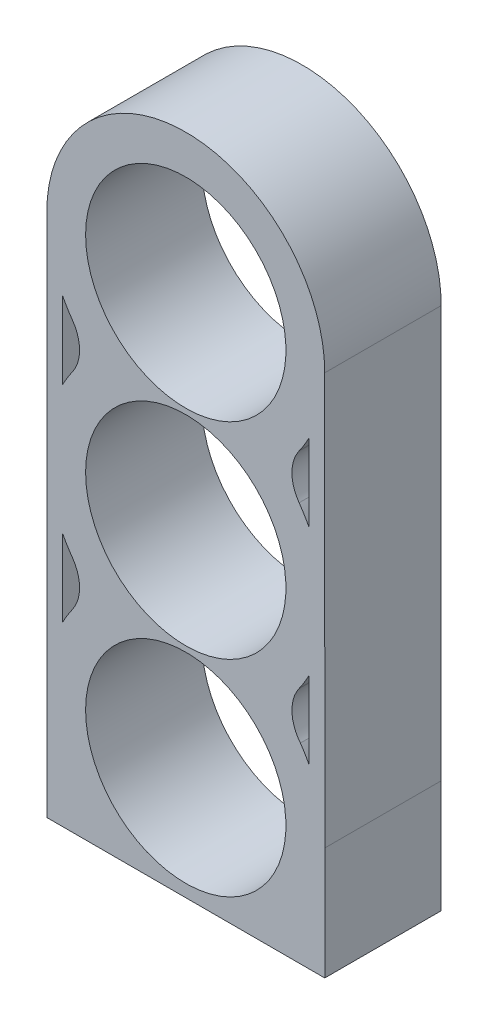
ISO-10303-21;
HEADER;
FILE_DESCRIPTION(('STEP AP214'),'2;1');
FILE_NAME('part.step','',(''),(''),'','','');
FILE_SCHEMA(('AUTOMOTIVE_DESIGN { 1 0 10303 214 1 1 1 1 }'));
ENDSEC;
DATA;
#1=APPLICATION_CONTEXT('core data for automotive mechanical design processes');
#2=APPLICATION_PROTOCOL_DEFINITION('international standard','automotive_design',2000,#1);
#3=PRODUCT_CONTEXT('',#1,'mechanical');
#4=PRODUCT('Part','Part','',(#3));
#5=PRODUCT_RELATED_PRODUCT_CATEGORY('part','',(#4));
#6=PRODUCT_DEFINITION_FORMATION('','',#4);
#7=PRODUCT_DEFINITION_CONTEXT('part definition',#1,'design');
#8=PRODUCT_DEFINITION('design','',#6,#7);
#9=PRODUCT_DEFINITION_SHAPE('','',#8);
#10=(LENGTH_UNIT() NAMED_UNIT(*) SI_UNIT(.MILLI.,.METRE.));
#11=(NAMED_UNIT(*) PLANE_ANGLE_UNIT() SI_UNIT($,.RADIAN.));
#12=(NAMED_UNIT(*) SI_UNIT($,.STERADIAN.) SOLID_ANGLE_UNIT());
#13=UNCERTAINTY_MEASURE_WITH_UNIT(LENGTH_MEASURE(1.E-05),#10,'distance_accuracy_value','');
#14=(GEOMETRIC_REPRESENTATION_CONTEXT(3) GLOBAL_UNCERTAINTY_ASSIGNED_CONTEXT((#13)) GLOBAL_UNIT_ASSIGNED_CONTEXT((#10,
#11,#12)) REPRESENTATION_CONTEXT('',''));
#15=CARTESIAN_POINT('',(0.,0.,0.));
#16=DIRECTION('',(0.,0.,1.));
#17=DIRECTION('',(1.,0.,0.));
#18=AXIS2_PLACEMENT_3D('',#15,#16,#17);
#19=CARTESIAN_POINT('',(45.4727606187345,0.00228368156702052,38.1));
#20=DIRECTION('',(0.999999998738932,5.02208692207655E-05,0.));
#21=DIRECTION('',(-5.02208692207655E-05,0.999999998738932,0.));
#22=AXIS2_PLACEMENT_3D('',#19,#20,#21);
#23=PLANE('',#22);
#24=DIRECTION('',(5.02208692207655E-05,-0.999999998738932,0.));
#25=VECTOR('',#24,1.);
#26=CARTESIAN_POINT('',(45.4727606187345,0.00228368156702052,0.));
#27=LINE('',#26,#25);
#28=CARTESIAN_POINT('',(45.466,134.62,0.));
#29=VERTEX_POINT('',#28);
#30=CARTESIAN_POINT('',(45.472760733423,0.,0.));
#31=VERTEX_POINT('',#30);
#32=EDGE_CURVE('E313',#29,#31,#27,.T.);
#33=ORIENTED_EDGE('',*,*,#32,.F.);
#34=DIRECTION('',(0.,0.,-1.));
#35=VECTOR('',#34,1.);
#36=CARTESIAN_POINT('',(45.466,134.62,38.1));
#37=LINE('',#36,#35);
#38=CARTESIAN_POINT('',(45.466,134.62,38.1));
#39=VERTEX_POINT('',#38);
#40=EDGE_CURVE('E11',#39,#29,#37,.T.);
#41=ORIENTED_EDGE('',*,*,#40,.F.);
#42=DIRECTION('',(5.02208692207655E-05,-0.999999998738932,0.));
#43=VECTOR('',#42,1.);
#44=CARTESIAN_POINT('',(45.4727606187345,0.00228368156702052,38.1));
#45=LINE('',#44,#43);
#46=CARTESIAN_POINT('',(45.472760733423,0.,38.1));
#47=VERTEX_POINT('',#46);
#48=EDGE_CURVE('E372',#39,#47,#45,.T.);
#49=ORIENTED_EDGE('',*,*,#48,.T.);
#50=DIRECTION('',(0.,0.,-1.));
#51=VECTOR('',#50,1.);
#52=CARTESIAN_POINT('',(45.472760733423,0.,38.1));
#53=LINE('',#52,#51);
#54=EDGE_CURVE('E54',#47,#31,#53,.T.);
#55=ORIENTED_EDGE('',*,*,#54,.T.);
#56=EDGE_LOOP('',(#33,#41,#49,#55));
#57=FACE_BOUND('',#56,.T.);
#58=ADVANCED_FACE('F35',(#57),#23,.T.);
#59=CARTESIAN_POINT('',(0.,134.62,38.1));
#60=DIRECTION('',(0.,0.,-1.));
#61=DIRECTION('',(-1.,0.,0.));
#62=AXIS2_PLACEMENT_3D('',#59,#60,#61);
#63=CYLINDRICAL_SURFACE('',#62,45.466);
#64=CARTESIAN_POINT('',(0.,134.62,0.));
#65=DIRECTION('',(0.,0.,1.));
#66=DIRECTION('',(1.,0.,0.));
#67=AXIS2_PLACEMENT_3D('',#64,#65,#66);
#68=CIRCLE('',#67,45.466);
#69=CARTESIAN_POINT('',(-45.466,134.62,0.));
#70=VERTEX_POINT('',#69);
#71=EDGE_CURVE('E315',#29,#70,#68,.T.);
#72=ORIENTED_EDGE('',*,*,#71,.T.);
#73=DIRECTION('',(0.,0.,-1.));
#74=VECTOR('',#73,1.);
#75=CARTESIAN_POINT('',(-45.466,134.62,38.1));
#76=LINE('',#75,#74);
#77=CARTESIAN_POINT('',(-45.466,134.62,38.1));
#78=VERTEX_POINT('',#77);
#79=EDGE_CURVE('E45',#78,#70,#76,.T.);
#80=ORIENTED_EDGE('',*,*,#79,.F.);
#81=CARTESIAN_POINT('',(0.,134.62,38.1));
#82=DIRECTION('',(0.,0.,1.));
#83=DIRECTION('',(1.,0.,0.));
#84=AXIS2_PLACEMENT_3D('',#81,#82,#83);
#85=CIRCLE('',#84,45.466);
#86=EDGE_CURVE('E201',#39,#78,#85,.T.);
#87=ORIENTED_EDGE('',*,*,#86,.F.);
#88=ORIENTED_EDGE('',*,*,#40,.T.);
#89=EDGE_LOOP('',(#72,#80,#87,#88));
#90=FACE_BOUND('',#89,.T.);
#91=ADVANCED_FACE('F377',(#90),#63,.T.);
#92=CARTESIAN_POINT('',(-45.466,0.,38.1));
#93=DIRECTION('',(1.,0.,0.));
#94=DIRECTION('',(0.,1.,0.));
#95=AXIS2_PLACEMENT_3D('',#92,#93,#94);
#96=PLANE('',#95);
#97=DIRECTION('',(0.,-1.,0.));
#98=VECTOR('',#97,1.);
#99=CARTESIAN_POINT('',(-45.466,0.,0.));
#100=LINE('',#99,#98);
#101=CARTESIAN_POINT('',(-45.466,-36.83,0.));
#102=VERTEX_POINT('',#101);
#103=EDGE_CURVE('E207',#70,#102,#100,.T.);
#104=ORIENTED_EDGE('',*,*,#103,.T.);
#105=DIRECTION('',(0.,0.,-1.));
#106=VECTOR('',#105,1.);
#107=CARTESIAN_POINT('',(-45.466,-36.83,38.1));
#108=LINE('',#107,#106);
#109=CARTESIAN_POINT('',(-45.466,-36.83,38.1));
#110=VERTEX_POINT('',#109);
#111=EDGE_CURVE('E190',#110,#102,#108,.T.);
#112=ORIENTED_EDGE('',*,*,#111,.F.);
#113=DIRECTION('',(0.,-1.,0.));
#114=VECTOR('',#113,1.);
#115=CARTESIAN_POINT('',(-45.466,0.,38.1));
#116=LINE('',#115,#114);
#117=EDGE_CURVE('E195',#78,#110,#116,.T.);
#118=ORIENTED_EDGE('',*,*,#117,.F.);
#119=ORIENTED_EDGE('',*,*,#79,.T.);
#120=EDGE_LOOP('',(#104,#112,#118,#119));
#121=FACE_BOUND('',#120,.T.);
#122=ADVANCED_FACE('F206',(#121),#96,.F.);
#123=CARTESIAN_POINT('',(0.,-36.83,38.1));
#124=DIRECTION('',(0.,1.,0.));
#125=DIRECTION('',(0.,0.,1.));
#126=AXIS2_PLACEMENT_3D('',#123,#124,#125);
#127=PLANE('',#126);
#128=DIRECTION('',(1.,0.,0.));
#129=VECTOR('',#128,1.);
#130=CARTESIAN_POINT('',(0.,-36.83,0.));
#131=LINE('',#130,#129);
#132=CARTESIAN_POINT('',(45.472760733423,-36.83,0.));
#133=VERTEX_POINT('',#132);
#134=EDGE_CURVE('E319',#102,#133,#131,.T.);
#135=ORIENTED_EDGE('',*,*,#134,.T.);
#136=DIRECTION('',(0.,0.,-1.));
#137=VECTOR('',#136,1.);
#138=CARTESIAN_POINT('',(45.472760733423,-36.83,38.1));
#139=LINE('',#138,#137);
#140=CARTESIAN_POINT('',(45.472760733423,-36.83,38.1));
#141=VERTEX_POINT('',#140);
#142=EDGE_CURVE('E119',#141,#133,#139,.T.);
#143=ORIENTED_EDGE('',*,*,#142,.F.);
#144=DIRECTION('',(1.,0.,0.));
#145=VECTOR('',#144,1.);
#146=CARTESIAN_POINT('',(0.,-36.83,38.1));
#147=LINE('',#146,#145);
#148=EDGE_CURVE('E186',#110,#141,#147,.T.);
#149=ORIENTED_EDGE('',*,*,#148,.F.);
#150=ORIENTED_EDGE('',*,*,#111,.T.);
#151=EDGE_LOOP('',(#135,#143,#149,#150));
#152=FACE_BOUND('',#151,.T.);
#153=ADVANCED_FACE('F188',(#152),#127,.F.);
#154=CARTESIAN_POINT('',(-40.386,0.,38.1));
#155=DIRECTION('',(1.,0.,0.));
#156=DIRECTION('',(0.,1.,0.));
#157=AXIS2_PLACEMENT_3D('',#154,#155,#156);
#158=PLANE('',#157);
#159=DIRECTION('',(0.,-1.,0.));
#160=VECTOR('',#159,1.);
#161=CARTESIAN_POINT('',(-40.386,0.,0.));
#162=LINE('',#161,#160);
#163=CARTESIAN_POINT('',(-40.386,113.736318332248,0.));
#164=VERTEX_POINT('',#163);
#165=CARTESIAN_POINT('',(-40.386,88.1936816677519,0.));
#166=VERTEX_POINT('',#165);
#167=EDGE_CURVE('E295',#164,#166,#162,.T.);
#168=ORIENTED_EDGE('',*,*,#167,.F.);
#169=DIRECTION('',(0.,0.,-1.));
#170=VECTOR('',#169,1.);
#171=CARTESIAN_POINT('',(-40.386,113.736318332248,38.1));
#172=LINE('',#171,#170);
#173=CARTESIAN_POINT('',(-40.386,113.736318332248,38.1));
#174=VERTEX_POINT('',#173);
#175=EDGE_CURVE('E220',#174,#164,#172,.T.);
#176=ORIENTED_EDGE('',*,*,#175,.F.);
#177=DIRECTION('',(0.,-1.,0.));
#178=VECTOR('',#177,1.);
#179=CARTESIAN_POINT('',(-40.386,0.,38.1));
#180=LINE('',#179,#178);
#181=CARTESIAN_POINT('',(-40.386,88.1936816677519,38.1));
#182=VERTEX_POINT('',#181);
#183=EDGE_CURVE('E356',#174,#182,#180,.T.);
#184=ORIENTED_EDGE('',*,*,#183,.T.);
#185=DIRECTION('',(0.,0.,-1.));
#186=VECTOR('',#185,1.);
#187=CARTESIAN_POINT('',(-40.386,88.1936816677519,38.1));
#188=LINE('',#187,#186);
#189=EDGE_CURVE('E213',#182,#166,#188,.T.);
#190=ORIENTED_EDGE('',*,*,#189,.T.);
#191=EDGE_LOOP('',(#168,#176,#184,#190));
#192=FACE_BOUND('',#191,.T.);
#193=ADVANCED_FACE('F418',(#192),#158,.T.);
#194=CARTESIAN_POINT('',(0.,134.62,38.1));
#195=DIRECTION('',(0.,0.,-1.));
#196=DIRECTION('',(-1.,0.,0.));
#197=AXIS2_PLACEMENT_3D('',#194,#195,#196);
#198=CYLINDRICAL_SURFACE('',#197,45.466);
#199=CARTESIAN_POINT('',(0.,134.62,0.));
#200=DIRECTION('',(0.,0.,1.));
#201=DIRECTION('',(1.,0.,0.));
#202=AXIS2_PLACEMENT_3D('',#199,#200,#201);
#203=CIRCLE('',#202,45.466);
#204=CARTESIAN_POINT('',(-37.0825057507235,108.313253275109,0.));
#205=VERTEX_POINT('',#204);
#206=EDGE_CURVE('E298',#164,#205,#203,.T.);
#207=ORIENTED_EDGE('',*,*,#206,.T.);
#208=DIRECTION('',(0.,0.,-1.));
#209=VECTOR('',#208,1.);
#210=CARTESIAN_POINT('',(-37.0825057507235,108.313253275109,38.1));
#211=LINE('',#210,#209);
#212=CARTESIAN_POINT('',(-37.0825057507235,108.313253275109,38.1));
#213=VERTEX_POINT('',#212);
#214=EDGE_CURVE('E218',#213,#205,#211,.T.);
#215=ORIENTED_EDGE('',*,*,#214,.F.);
#216=CARTESIAN_POINT('',(0.,134.62,38.1));
#217=DIRECTION('',(0.,0.,1.));
#218=DIRECTION('',(1.,0.,0.));
#219=AXIS2_PLACEMENT_3D('',#216,#217,#218);
#220=CIRCLE('',#219,45.466);
#221=EDGE_CURVE('E359',#174,#213,#220,.T.);
#222=ORIENTED_EDGE('',*,*,#221,.F.);
#223=ORIENTED_EDGE('',*,*,#175,.T.);
#224=EDGE_LOOP('',(#207,#215,#222,#223));
#225=FACE_BOUND('',#224,.T.);
#226=ADVANCED_FACE('F414',(#225),#198,.T.);
#227=CARTESIAN_POINT('',(-47.4407475805346,100.965,38.1));
#228=DIRECTION('',(0.,0.,-1.));
#229=DIRECTION('',(-1.,0.,0.));
#230=AXIS2_PLACEMENT_3D('',#227,#228,#229);
#231=CYLINDRICAL_SURFACE('',#230,12.7);
#232=CARTESIAN_POINT('',(-47.4407475805346,100.965,0.));
#233=DIRECTION('',(0.,0.,1.));
#234=DIRECTION('',(1.,0.,0.));
#235=AXIS2_PLACEMENT_3D('',#232,#233,#234);
#236=CIRCLE('',#235,12.7);
#237=CARTESIAN_POINT('',(-37.0825057507235,93.6167467248908,0.));
#238=VERTEX_POINT('',#237);
#239=EDGE_CURVE('E301',#238,#205,#236,.T.);
#240=ORIENTED_EDGE('',*,*,#239,.F.);
#241=DIRECTION('',(0.,0.,-1.));
#242=VECTOR('',#241,1.);
#243=CARTESIAN_POINT('',(-37.0825057507235,93.6167467248908,38.1));
#244=LINE('',#243,#242);
#245=CARTESIAN_POINT('',(-37.0825057507235,93.6167467248908,38.1));
#246=VERTEX_POINT('',#245);
#247=EDGE_CURVE('E215',#246,#238,#244,.T.);
#248=ORIENTED_EDGE('',*,*,#247,.F.);
#249=CARTESIAN_POINT('',(-47.4407475805346,100.965,38.1));
#250=DIRECTION('',(0.,0.,1.));
#251=DIRECTION('',(1.,0.,0.));
#252=AXIS2_PLACEMENT_3D('',#249,#250,#251);
#253=CIRCLE('',#252,12.7);
#254=EDGE_CURVE('E361',#246,#213,#253,.T.);
#255=ORIENTED_EDGE('',*,*,#254,.T.);
#256=ORIENTED_EDGE('',*,*,#214,.T.);
#257=EDGE_LOOP('',(#240,#248,#255,#256));
#258=FACE_BOUND('',#257,.T.);
#259=ADVANCED_FACE('F410',(#258),#231,.F.);
#260=CARTESIAN_POINT('',(-40.386,0.,38.1));
#261=DIRECTION('',(1.,0.,0.));
#262=DIRECTION('',(0.,1.,0.));
#263=AXIS2_PLACEMENT_3D('',#260,#261,#262);
#264=PLANE('',#263);
#265=DIRECTION('',(0.,-1.,0.));
#266=VECTOR('',#265,1.);
#267=CARTESIAN_POINT('',(-40.386,0.,0.));
#268=LINE('',#267,#266);
#269=CARTESIAN_POINT('',(-40.386,46.4263183322481,0.));
#270=VERTEX_POINT('',#269);
#271=CARTESIAN_POINT('',(-40.386,20.883681667752,0.));
#272=VERTEX_POINT('',#271);
#273=EDGE_CURVE('E283',#270,#272,#268,.T.);
#274=ORIENTED_EDGE('',*,*,#273,.F.);
#275=DIRECTION('',(0.,0.,-1.));
#276=VECTOR('',#275,1.);
#277=CARTESIAN_POINT('',(-40.386,46.4263183322481,38.1));
#278=LINE('',#277,#276);
#279=CARTESIAN_POINT('',(-40.386,46.4263183322481,38.1));
#280=VERTEX_POINT('',#279);
#281=EDGE_CURVE('E216',#280,#270,#278,.T.);
#282=ORIENTED_EDGE('',*,*,#281,.F.);
#283=DIRECTION('',(0.,-1.,0.));
#284=VECTOR('',#283,1.);
#285=CARTESIAN_POINT('',(-40.386,0.,38.1));
#286=LINE('',#285,#284);
#287=CARTESIAN_POINT('',(-40.386,20.883681667752,38.1));
#288=VERTEX_POINT('',#287);
#289=EDGE_CURVE('E346',#280,#288,#286,.T.);
#290=ORIENTED_EDGE('',*,*,#289,.T.);
#291=DIRECTION('',(0.,0.,-1.));
#292=VECTOR('',#291,1.);
#293=CARTESIAN_POINT('',(-40.386,20.883681667752,38.1));
#294=LINE('',#293,#292);
#295=EDGE_CURVE('E222',#288,#272,#294,.T.);
#296=ORIENTED_EDGE('',*,*,#295,.T.);
#297=EDGE_LOOP('',(#274,#282,#290,#296));
#298=FACE_BOUND('',#297,.T.);
#299=ADVANCED_FACE('F413',(#298),#264,.T.);
#300=CARTESIAN_POINT('',(0.,67.31,38.1));
#301=DIRECTION('',(0.,0.,-1.));
#302=DIRECTION('',(-1.,0.,0.));
#303=AXIS2_PLACEMENT_3D('',#300,#301,#302);
#304=CYLINDRICAL_SURFACE('',#303,45.466);
#305=CARTESIAN_POINT('',(0.,67.31,0.));
#306=DIRECTION('',(0.,0.,1.));
#307=DIRECTION('',(1.,0.,0.));
#308=AXIS2_PLACEMENT_3D('',#305,#306,#307);
#309=CIRCLE('',#308,45.466);
#310=CARTESIAN_POINT('',(-37.0825057507236,41.0032532751092,0.));
#311=VERTEX_POINT('',#310);
#312=EDGE_CURVE('E286',#270,#311,#309,.T.);
#313=ORIENTED_EDGE('',*,*,#312,.T.);
#314=DIRECTION('',(0.,0.,-1.));
#315=VECTOR('',#314,1.);
#316=CARTESIAN_POINT('',(-37.0825057507236,41.0032532751092,38.1));
#317=LINE('',#316,#315);
#318=CARTESIAN_POINT('',(-37.0825057507236,41.0032532751092,38.1));
#319=VERTEX_POINT('',#318);
#320=EDGE_CURVE('E227',#319,#311,#317,.T.);
#321=ORIENTED_EDGE('',*,*,#320,.F.);
#322=CARTESIAN_POINT('',(0.,67.31,38.1));
#323=DIRECTION('',(0.,0.,1.));
#324=DIRECTION('',(1.,0.,0.));
#325=AXIS2_PLACEMENT_3D('',#322,#323,#324);
#326=CIRCLE('',#325,45.466);
#327=EDGE_CURVE('E349',#280,#319,#326,.T.);
#328=ORIENTED_EDGE('',*,*,#327,.F.);
#329=ORIENTED_EDGE('',*,*,#281,.T.);
#330=EDGE_LOOP('',(#313,#321,#328,#329));
#331=FACE_BOUND('',#330,.T.);
#332=ADVANCED_FACE('F431',(#331),#304,.T.);
#333=CARTESIAN_POINT('',(-47.4407475805346,33.655,38.1));
#334=DIRECTION('',(0.,0.,-1.));
#335=DIRECTION('',(-1.,0.,0.));
#336=AXIS2_PLACEMENT_3D('',#333,#334,#335);
#337=CYLINDRICAL_SURFACE('',#336,12.7);
#338=CARTESIAN_POINT('',(-47.4407475805346,33.655,0.));
#339=DIRECTION('',(0.,0.,1.));
#340=DIRECTION('',(1.,0.,0.));
#341=AXIS2_PLACEMENT_3D('',#338,#339,#340);
#342=CIRCLE('',#341,12.7);
#343=CARTESIAN_POINT('',(-37.0825057507235,26.3067467248908,0.));
#344=VERTEX_POINT('',#343);
#345=EDGE_CURVE('E289',#344,#311,#342,.T.);
#346=ORIENTED_EDGE('',*,*,#345,.F.);
#347=DIRECTION('',(0.,0.,-1.));
#348=VECTOR('',#347,1.);
#349=CARTESIAN_POINT('',(-37.0825057507235,26.3067467248908,38.1));
#350=LINE('',#349,#348);
#351=CARTESIAN_POINT('',(-37.0825057507235,26.3067467248908,38.1));
#352=VERTEX_POINT('',#351);
#353=EDGE_CURVE('E224',#352,#344,#350,.T.);
#354=ORIENTED_EDGE('',*,*,#353,.F.);
#355=CARTESIAN_POINT('',(-47.4407475805346,33.655,38.1));
#356=DIRECTION('',(0.,0.,1.));
#357=DIRECTION('',(1.,0.,0.));
#358=AXIS2_PLACEMENT_3D('',#355,#356,#357);
#359=CIRCLE('',#358,12.7);
#360=EDGE_CURVE('E351',#352,#319,#359,.T.);
#361=ORIENTED_EDGE('',*,*,#360,.T.);
#362=ORIENTED_EDGE('',*,*,#320,.T.);
#363=EDGE_LOOP('',(#346,#354,#361,#362));
#364=FACE_BOUND('',#363,.T.);
#365=ADVANCED_FACE('F427',(#364),#337,.F.);
#366=CARTESIAN_POINT('',(40.3927606251407,0.00202855955136445,38.1));
#367=DIRECTION('',(0.999999998738932,5.02208692204044E-05,0.));
#368=DIRECTION('',(-5.02208692204044E-05,0.999999998738932,0.));
#369=AXIS2_PLACEMENT_3D('',#366,#367,#368);
#370=PLANE('',#369);
#371=DIRECTION('',(5.02208692204044E-05,-0.999999998738932,0.));
#372=VECTOR('',#371,1.);
#373=CARTESIAN_POINT('',(40.3927606251407,0.00202855955136445,0.));
#374=LINE('',#373,#372);
#375=CARTESIAN_POINT('',(40.3870486883863,113.738346467726,0.));
#376=VERTEX_POINT('',#375);
#377=CARTESIAN_POINT('',(40.3883317901522,88.1891717079147,0.));
#378=VERTEX_POINT('',#377);
#379=EDGE_CURVE('E274',#376,#378,#374,.T.);
#380=ORIENTED_EDGE('',*,*,#379,.T.);
#381=DIRECTION('',(0.,0.,-1.));
#382=VECTOR('',#381,1.);
#383=CARTESIAN_POINT('',(40.3883317901522,88.1891717079147,38.1));
#384=LINE('',#383,#382);
#385=CARTESIAN_POINT('',(40.3883317901522,88.1891717079147,38.1));
#386=VERTEX_POINT('',#385);
#387=EDGE_CURVE('E225',#386,#378,#384,.T.);
#388=ORIENTED_EDGE('',*,*,#387,.F.);
#389=DIRECTION('',(5.02208692204044E-05,-0.999999998738932,0.));
#390=VECTOR('',#389,1.);
#391=CARTESIAN_POINT('',(40.3927606251407,0.00202855955136445,38.1));
#392=LINE('',#391,#390);
#393=CARTESIAN_POINT('',(40.3870486883863,113.738346467726,38.1));
#394=VERTEX_POINT('',#393);
#395=EDGE_CURVE('E337',#394,#386,#392,.T.);
#396=ORIENTED_EDGE('',*,*,#395,.F.);
#397=DIRECTION('',(0.,0.,-1.));
#398=VECTOR('',#397,1.);
#399=CARTESIAN_POINT('',(40.3870486883863,113.738346467726,38.1));
#400=LINE('',#399,#398);
#401=EDGE_CURVE('E230',#394,#376,#400,.T.);
#402=ORIENTED_EDGE('',*,*,#401,.T.);
#403=EDGE_LOOP('',(#380,#388,#396,#402));
#404=FACE_BOUND('',#403,.T.);
#405=ADVANCED_FACE('F430',(#404),#370,.F.);
#406=CARTESIAN_POINT('',(0.,67.31,38.1));
#407=DIRECTION('',(0.,0.,-1.));
#408=DIRECTION('',(-1.,0.,0.));
#409=AXIS2_PLACEMENT_3D('',#406,#407,#408);
#410=CYLINDRICAL_SURFACE('',#409,45.466);
#411=CARTESIAN_POINT('',(0.,67.31,0.));
#412=DIRECTION('',(0.,0.,1.));
#413=DIRECTION('',(1.,0.,0.));
#414=AXIS2_PLACEMENT_3D('',#411,#412,#413);
#415=CIRCLE('',#414,45.466);
#416=CARTESIAN_POINT('',(37.0825057507236,93.6167467248908,0.));
#417=VERTEX_POINT('',#416);
#418=EDGE_CURVE('E277',#378,#417,#415,.T.);
#419=ORIENTED_EDGE('',*,*,#418,.T.);
#420=DIRECTION('',(0.,0.,-1.));
#421=VECTOR('',#420,1.);
#422=CARTESIAN_POINT('',(37.0825057507236,93.6167467248908,38.1));
#423=LINE('',#422,#421);
#424=CARTESIAN_POINT('',(37.0825057507236,93.6167467248908,38.1));
#425=VERTEX_POINT('',#424);
#426=EDGE_CURVE('E236',#425,#417,#423,.T.);
#427=ORIENTED_EDGE('',*,*,#426,.F.);
#428=CARTESIAN_POINT('',(0.,67.31,38.1));
#429=DIRECTION('',(0.,0.,1.));
#430=DIRECTION('',(1.,0.,0.));
#431=AXIS2_PLACEMENT_3D('',#428,#429,#430);
#432=CIRCLE('',#431,45.466);
#433=EDGE_CURVE('E340',#386,#425,#432,.T.);
#434=ORIENTED_EDGE('',*,*,#433,.F.);
#435=ORIENTED_EDGE('',*,*,#387,.T.);
#436=EDGE_LOOP('',(#419,#427,#434,#435));
#437=FACE_BOUND('',#436,.T.);
#438=ADVANCED_FACE('F446',(#437),#410,.T.);
#439=CARTESIAN_POINT('',(47.4407475805346,100.965,38.1));
#440=DIRECTION('',(0.,0.,-1.));
#441=DIRECTION('',(-1.,0.,0.));
#442=AXIS2_PLACEMENT_3D('',#439,#440,#441);
#443=CYLINDRICAL_SURFACE('',#442,12.7);
#444=CARTESIAN_POINT('',(47.4407475805346,100.965,0.));
#445=DIRECTION('',(0.,0.,1.));
#446=DIRECTION('',(1.,0.,0.));
#447=AXIS2_PLACEMENT_3D('',#444,#445,#446);
#448=CIRCLE('',#447,12.7);
#449=CARTESIAN_POINT('',(37.0825057507235,108.313253275109,0.));
#450=VERTEX_POINT('',#449);
#451=EDGE_CURVE('E279',#417,#450,#448,.F.);
#452=ORIENTED_EDGE('',*,*,#451,.T.);
#453=DIRECTION('',(0.,0.,-1.));
#454=VECTOR('',#453,1.);
#455=CARTESIAN_POINT('',(37.0825057507235,108.313253275109,38.1));
#456=LINE('',#455,#454);
#457=CARTESIAN_POINT('',(37.0825057507235,108.313253275109,38.1));
#458=VERTEX_POINT('',#457);
#459=EDGE_CURVE('E233',#458,#450,#456,.T.);
#460=ORIENTED_EDGE('',*,*,#459,.F.);
#461=CARTESIAN_POINT('',(47.4407475805346,100.965,38.1));
#462=DIRECTION('',(0.,0.,1.));
#463=DIRECTION('',(1.,0.,0.));
#464=AXIS2_PLACEMENT_3D('',#461,#462,#463);
#465=CIRCLE('',#464,12.7);
#466=EDGE_CURVE('E342',#425,#458,#465,.F.);
#467=ORIENTED_EDGE('',*,*,#466,.F.);
#468=ORIENTED_EDGE('',*,*,#426,.T.);
#469=EDGE_LOOP('',(#452,#460,#467,#468));
#470=FACE_BOUND('',#469,.T.);
#471=ADVANCED_FACE('F443',(#470),#443,.F.);
#472=CARTESIAN_POINT('',(40.3927606251408,0.00202855955137961,38.1));
#473=DIRECTION('',(0.999999998738932,5.02208692207797E-05,0.));
#474=DIRECTION('',(-5.02208692207797E-05,0.999999998738932,0.));
#475=AXIS2_PLACEMENT_3D('',#472,#473,#474);
#476=PLANE('',#475);
#477=DIRECTION('',(5.02208692207797E-05,-0.999999998738932,0.));
#478=VECTOR('',#477,1.);
#479=CARTESIAN_POINT('',(40.3927606251408,0.00202855955137961,0.));
#480=LINE('',#479,#478);
#481=CARTESIAN_POINT('',(40.3904287267234,46.4348850716582,0.));
#482=VERTEX_POINT('',#481);
#483=CARTESIAN_POINT('',(40.3917098372683,20.9253595864671,0.));
#484=VERTEX_POINT('',#483);
#485=EDGE_CURVE('E258',#482,#484,#480,.T.);
#486=ORIENTED_EDGE('',*,*,#485,.T.);
#487=DIRECTION('',(0.,0.,-1.));
#488=VECTOR('',#487,1.);
#489=CARTESIAN_POINT('',(40.3917098372683,20.9253595864671,38.1));
#490=LINE('',#489,#488);
#491=CARTESIAN_POINT('',(40.3917098372683,20.9253595864671,38.1));
#492=VERTEX_POINT('',#491);
#493=EDGE_CURVE('E39',#492,#484,#490,.T.);
#494=ORIENTED_EDGE('',*,*,#493,.F.);
#495=DIRECTION('',(5.02208692207797E-05,-0.999999998738932,0.));
#496=VECTOR('',#495,1.);
#497=CARTESIAN_POINT('',(40.3927606251408,0.00202855955137961,38.1));
#498=LINE('',#497,#496);
#499=CARTESIAN_POINT('',(40.3904287267234,46.4348850716582,38.1));
#500=VERTEX_POINT('',#499);
#501=EDGE_CURVE('E326',#500,#492,#498,.T.);
#502=ORIENTED_EDGE('',*,*,#501,.F.);
#503=DIRECTION('',(0.,0.,-1.));
#504=VECTOR('',#503,1.);
#505=CARTESIAN_POINT('',(40.3904287267234,46.4348850716582,38.1));
#506=LINE('',#505,#504);
#507=EDGE_CURVE('E241',#500,#482,#506,.T.);
#508=ORIENTED_EDGE('',*,*,#507,.T.);
#509=EDGE_LOOP('',(#486,#494,#502,#508));
#510=FACE_BOUND('',#509,.T.);
#511=ADVANCED_FACE('F259',(#510),#476,.F.);
#512=CARTESIAN_POINT('',(0.,0.,38.1));
#513=DIRECTION('',(0.,0.,-1.));
#514=DIRECTION('',(-1.,0.,0.));
#515=AXIS2_PLACEMENT_3D('',#512,#513,#514);
#516=CYLINDRICAL_SURFACE('',#515,45.4902285925343);
#517=CARTESIAN_POINT('',(0.,0.,0.));
#518=DIRECTION('',(0.,0.,1.));
#519=DIRECTION('',(1.,0.,0.));
#520=AXIS2_PLACEMENT_3D('',#517,#518,#519);
#521=CIRCLE('',#520,45.4902285925343);
#522=CARTESIAN_POINT('',(37.4991609475191,25.7521615720523,0.));
#523=VERTEX_POINT('',#522);
#524=EDGE_CURVE('E254',#484,#523,#521,.T.);
#525=ORIENTED_EDGE('',*,*,#524,.T.);
#526=DIRECTION('',(0.,0.,-1.));
#527=VECTOR('',#526,1.);
#528=CARTESIAN_POINT('',(37.4991609475191,25.7521615720523,38.1));
#529=LINE('',#528,#527);
#530=CARTESIAN_POINT('',(37.4991609475191,25.7521615720523,38.1));
#531=VERTEX_POINT('',#530);
#532=EDGE_CURVE('E246',#531,#523,#529,.T.);
#533=ORIENTED_EDGE('',*,*,#532,.F.);
#534=CARTESIAN_POINT('',(0.,0.,38.1));
#535=DIRECTION('',(0.,0.,1.));
#536=DIRECTION('',(1.,0.,0.));
#537=AXIS2_PLACEMENT_3D('',#534,#535,#536);
#538=CIRCLE('',#537,45.4902285925343);
#539=EDGE_CURVE('E132',#492,#531,#538,.T.);
#540=ORIENTED_EDGE('',*,*,#539,.F.);
#541=ORIENTED_EDGE('',*,*,#493,.T.);
#542=EDGE_LOOP('',(#525,#533,#540,#541));
#543=FACE_BOUND('',#542,.T.);
#544=ADVANCED_FACE('F253',(#543),#516,.T.);
#545=CARTESIAN_POINT('',(47.4407475805346,33.655,38.1));
#546=DIRECTION('',(0.,0.,-1.));
#547=DIRECTION('',(-1.,0.,0.));
#548=AXIS2_PLACEMENT_3D('',#545,#546,#547);
#549=CYLINDRICAL_SURFACE('',#548,12.7);
#550=CARTESIAN_POINT('',(47.4407475805346,33.655,0.));
#551=DIRECTION('',(0.,0.,1.));
#552=DIRECTION('',(1.,0.,0.));
#553=AXIS2_PLACEMENT_3D('',#550,#551,#552);
#554=CIRCLE('',#553,12.7);
#555=CARTESIAN_POINT('',(37.0825057507236,41.0032532751092,0.));
#556=VERTEX_POINT('',#555);
#557=EDGE_CURVE('E265',#523,#556,#554,.F.);
#558=ORIENTED_EDGE('',*,*,#557,.T.);
#559=DIRECTION('',(0.,0.,-1.));
#560=VECTOR('',#559,1.);
#561=CARTESIAN_POINT('',(37.0825057507236,41.0032532751092,38.1));
#562=LINE('',#561,#560);
#563=CARTESIAN_POINT('',(37.0825057507236,41.0032532751092,38.1));
#564=VERTEX_POINT('',#563);
#565=EDGE_CURVE('E244',#564,#556,#562,.T.);
#566=ORIENTED_EDGE('',*,*,#565,.F.);
#567=CARTESIAN_POINT('',(47.4407475805346,33.655,38.1));
#568=DIRECTION('',(0.,0.,1.));
#569=DIRECTION('',(1.,0.,0.));
#570=AXIS2_PLACEMENT_3D('',#567,#568,#569);
#571=CIRCLE('',#570,12.7);
#572=EDGE_CURVE('E333',#531,#564,#571,.F.);
#573=ORIENTED_EDGE('',*,*,#572,.F.);
#574=ORIENTED_EDGE('',*,*,#532,.T.);
#575=EDGE_LOOP('',(#558,#566,#573,#574));
#576=FACE_BOUND('',#575,.T.);
#577=ADVANCED_FACE('F400',(#576),#549,.F.);
#578=CARTESIAN_POINT('',(0.,134.62,38.1));
#579=DIRECTION('',(0.,0.,-1.));
#580=DIRECTION('',(-1.,0.,0.));
#581=AXIS2_PLACEMENT_3D('',#578,#579,#580);
#582=CYLINDRICAL_SURFACE('',#581,32.766);
#583=CARTESIAN_POINT('',(0.,134.62,38.1));
#584=DIRECTION('',(0.,0.,1.));
#585=DIRECTION('',(1.,0.,0.));
#586=AXIS2_PLACEMENT_3D('',#583,#584,#585);
#587=CIRCLE('',#586,32.766);
#588=CARTESIAN_POINT('',(-32.766,134.62,38.1));
#589=VERTEX_POINT('',#588);
#590=EDGE_CURVE('E369',#589,#589,#587,.T.);
#591=CARTESIAN_POINT('',(0.,134.62,0.));
#592=DIRECTION('',(0.,0.,1.));
#593=DIRECTION('',(1.,0.,0.));
#594=AXIS2_PLACEMENT_3D('',#591,#592,#593);
#595=CIRCLE('',#594,32.766);
#596=CARTESIAN_POINT('',(-32.766,134.62,0.));
#597=VERTEX_POINT('',#596);
#598=EDGE_CURVE('E310',#597,#597,#595,.T.);
#599=CARTESIAN_POINT('',(-32.766,134.62,38.1));
#600=CARTESIAN_POINT('',(-32.766,134.62,37.703125));
#601=CARTESIAN_POINT('',(-32.766,134.62,37.30625));
#602=CARTESIAN_POINT('',(-32.766,134.62,36.5125));
#603=CARTESIAN_POINT('',(-32.766,134.62,36.115625));
#604=CARTESIAN_POINT('',(-32.766,134.62,35.321875));
#605=CARTESIAN_POINT('',(-32.766,134.62,34.925));
#606=CARTESIAN_POINT('',(-32.766,134.62,34.13125));
#607=CARTESIAN_POINT('',(-32.766,134.62,33.734375));
#608=CARTESIAN_POINT('',(-32.766,134.62,32.940625));
#609=CARTESIAN_POINT('',(-32.766,134.62,32.54375));
#610=CARTESIAN_POINT('',(-32.766,134.62,31.75));
#611=CARTESIAN_POINT('',(-32.766,134.62,31.353125));
#612=CARTESIAN_POINT('',(-32.766,134.62,30.559375));
#613=CARTESIAN_POINT('',(-32.766,134.62,30.1625));
#614=CARTESIAN_POINT('',(-32.766,134.62,29.36875));
#615=CARTESIAN_POINT('',(-32.766,134.62,28.971875));
#616=CARTESIAN_POINT('',(-32.766,134.62,28.178125));
#617=CARTESIAN_POINT('',(-32.766,134.62,27.78125));
#618=CARTESIAN_POINT('',(-32.766,134.62,26.9875));
#619=CARTESIAN_POINT('',(-32.766,134.62,26.590625));
#620=CARTESIAN_POINT('',(-32.766,134.62,25.796875));
#621=CARTESIAN_POINT('',(-32.766,134.62,25.4));
#622=CARTESIAN_POINT('',(-32.766,134.62,24.60625));
#623=CARTESIAN_POINT('',(-32.766,134.62,24.209375));
#624=CARTESIAN_POINT('',(-32.766,134.62,23.415625));
#625=CARTESIAN_POINT('',(-32.766,134.62,23.01875));
#626=CARTESIAN_POINT('',(-32.766,134.62,22.225));
#627=CARTESIAN_POINT('',(-32.766,134.62,21.828125));
#628=CARTESIAN_POINT('',(-32.766,134.62,21.034375));
#629=CARTESIAN_POINT('',(-32.766,134.62,20.6375));
#630=CARTESIAN_POINT('',(-32.766,134.62,19.84375));
#631=CARTESIAN_POINT('',(-32.766,134.62,19.446875));
#632=CARTESIAN_POINT('',(-32.766,134.62,18.653125));
#633=CARTESIAN_POINT('',(-32.766,134.62,18.25625));
#634=CARTESIAN_POINT('',(-32.766,134.62,17.4625));
#635=CARTESIAN_POINT('',(-32.766,134.62,17.065625));
#636=CARTESIAN_POINT('',(-32.766,134.62,16.271875));
#637=CARTESIAN_POINT('',(-32.766,134.62,15.875));
#638=CARTESIAN_POINT('',(-32.766,134.62,15.08125));
#639=CARTESIAN_POINT('',(-32.766,134.62,14.684375));
#640=CARTESIAN_POINT('',(-32.766,134.62,13.890625));
#641=CARTESIAN_POINT('',(-32.766,134.62,13.49375));
#642=CARTESIAN_POINT('',(-32.766,134.62,12.7));
#643=CARTESIAN_POINT('',(-32.766,134.62,12.303125));
#644=CARTESIAN_POINT('',(-32.766,134.62,11.509375));
#645=CARTESIAN_POINT('',(-32.766,134.62,11.1125));
#646=CARTESIAN_POINT('',(-32.766,134.62,10.31875));
#647=CARTESIAN_POINT('',(-32.766,134.62,9.921875));
#648=CARTESIAN_POINT('',(-32.766,134.62,9.128125));
#649=CARTESIAN_POINT('',(-32.766,134.62,8.73125));
#650=CARTESIAN_POINT('',(-32.766,134.62,7.9375));
#651=CARTESIAN_POINT('',(-32.766,134.62,7.540625));
#652=CARTESIAN_POINT('',(-32.766,134.62,6.746875));
#653=CARTESIAN_POINT('',(-32.766,134.62,6.35));
#654=CARTESIAN_POINT('',(-32.766,134.62,5.55625));
#655=CARTESIAN_POINT('',(-32.766,134.62,5.159375));
#656=CARTESIAN_POINT('',(-32.766,134.62,4.365625));
#657=CARTESIAN_POINT('',(-32.766,134.62,3.96875));
#658=CARTESIAN_POINT('',(-32.766,134.62,3.175));
#659=CARTESIAN_POINT('',(-32.766,134.62,2.778125));
#660=CARTESIAN_POINT('',(-32.766,134.62,1.984375));
#661=CARTESIAN_POINT('',(-32.766,134.62,1.5875));
#662=CARTESIAN_POINT('',(-32.766,134.62,0.79375));
#663=CARTESIAN_POINT('',(-32.766,134.62,0.396875));
#664=CARTESIAN_POINT('',(-32.766,134.62,0.));
#665=B_SPLINE_CURVE_WITH_KNOTS('',3,(#599,#600,#601,#602,#603,#604,#605,#606,#607,#608,#609,
#610,#611,#612,#613,#614,#615,#616,#617,#618,#619,#620,#621,#622,#623,#624,#625,#626,#627,#628,
#629,#630,#631,#632,#633,#634,#635,#636,#637,#638,#639,#640,#641,#642,#643,#644,#645,#646,#647,
#648,#649,#650,#651,#652,#653,#654,#655,#656,#657,#658,#659,#660,#661,#662,#663,#664),
.UNSPECIFIED.,.F.,.F.,(4,2,2,2,2,2,2,2,2,2,2,2,2,2,2,2,2,2,2,2,2,2,2,2,2,2,2,2,2,2,2,2,4),(0.,
1.19062499999999,2.38124999999999,3.571875,4.7625,5.953125,7.14375,8.33437499999999,9.525,
10.715625,11.90625,13.096875,14.2875,15.478125,16.66875,17.859375,19.05,20.240625,21.43125,
22.621875,23.8125,25.003125,26.19375,27.384375,28.575,29.765625,30.95625,32.146875,33.3375,
34.528125,35.71875,36.909375,38.1),.UNSPECIFIED.);
#666=EDGE_CURVE('BSEAM396',#589,#597,#665,.T.);
#667=ORIENTED_EDGE('',*,*,#590,.T.);
#668=ORIENTED_EDGE('',*,*,#598,.F.);
#669=ORIENTED_EDGE('',*,*,#666,.T.);
#670=ORIENTED_EDGE('',*,*,#666,.F.);
#671=EDGE_LOOP('',(#667,#669,#668,#670));
#672=FACE_BOUND('',#671,.T.);
#673=ADVANCED_FACE('F396',(#672),#582,.F.);
#674=CARTESIAN_POINT('',(0.,67.31,38.1));
#675=DIRECTION('',(0.,0.,-1.));
#676=DIRECTION('',(-1.,0.,0.));
#677=AXIS2_PLACEMENT_3D('',#674,#675,#676);
#678=CYLINDRICAL_SURFACE('',#677,32.766);
#679=CARTESIAN_POINT('',(0.,67.31,38.1));
#680=DIRECTION('',(0.,0.,1.));
#681=DIRECTION('',(1.,0.,0.));
#682=AXIS2_PLACEMENT_3D('',#679,#680,#681);
#683=CIRCLE('',#682,32.766);
#684=CARTESIAN_POINT('',(-32.766,67.31,38.1));
#685=VERTEX_POINT('',#684);
#686=EDGE_CURVE('E366',#685,#685,#683,.T.);
#687=CARTESIAN_POINT('',(0.,67.31,0.));
#688=DIRECTION('',(0.,0.,1.));
#689=DIRECTION('',(1.,0.,0.));
#690=AXIS2_PLACEMENT_3D('',#687,#688,#689);
#691=CIRCLE('',#690,32.766);
#692=CARTESIAN_POINT('',(-32.766,67.31,0.));
#693=VERTEX_POINT('',#692);
#694=EDGE_CURVE('E307',#693,#693,#691,.T.);
#695=CARTESIAN_POINT('',(-32.766,67.31,38.1));
#696=CARTESIAN_POINT('',(-32.766,67.31,37.703125));
#697=CARTESIAN_POINT('',(-32.766,67.31,37.30625));
#698=CARTESIAN_POINT('',(-32.766,67.31,36.5125));
#699=CARTESIAN_POINT('',(-32.766,67.31,36.115625));
#700=CARTESIAN_POINT('',(-32.766,67.31,35.321875));
#701=CARTESIAN_POINT('',(-32.766,67.31,34.925));
#702=CARTESIAN_POINT('',(-32.766,67.31,34.13125));
#703=CARTESIAN_POINT('',(-32.766,67.31,33.734375));
#704=CARTESIAN_POINT('',(-32.766,67.31,32.940625));
#705=CARTESIAN_POINT('',(-32.766,67.31,32.54375));
#706=CARTESIAN_POINT('',(-32.766,67.31,31.75));
#707=CARTESIAN_POINT('',(-32.766,67.31,31.353125));
#708=CARTESIAN_POINT('',(-32.766,67.31,30.559375));
#709=CARTESIAN_POINT('',(-32.766,67.31,30.1625));
#710=CARTESIAN_POINT('',(-32.766,67.31,29.36875));
#711=CARTESIAN_POINT('',(-32.766,67.31,28.971875));
#712=CARTESIAN_POINT('',(-32.766,67.31,28.178125));
#713=CARTESIAN_POINT('',(-32.766,67.31,27.78125));
#714=CARTESIAN_POINT('',(-32.766,67.31,26.9875));
#715=CARTESIAN_POINT('',(-32.766,67.31,26.590625));
#716=CARTESIAN_POINT('',(-32.766,67.31,25.796875));
#717=CARTESIAN_POINT('',(-32.766,67.31,25.4));
#718=CARTESIAN_POINT('',(-32.766,67.31,24.60625));
#719=CARTESIAN_POINT('',(-32.766,67.31,24.209375));
#720=CARTESIAN_POINT('',(-32.766,67.31,23.415625));
#721=CARTESIAN_POINT('',(-32.766,67.31,23.01875));
#722=CARTESIAN_POINT('',(-32.766,67.31,22.225));
#723=CARTESIAN_POINT('',(-32.766,67.31,21.828125));
#724=CARTESIAN_POINT('',(-32.766,67.31,21.034375));
#725=CARTESIAN_POINT('',(-32.766,67.31,20.6375));
#726=CARTESIAN_POINT('',(-32.766,67.31,19.84375));
#727=CARTESIAN_POINT('',(-32.766,67.31,19.446875));
#728=CARTESIAN_POINT('',(-32.766,67.31,18.653125));
#729=CARTESIAN_POINT('',(-32.766,67.31,18.25625));
#730=CARTESIAN_POINT('',(-32.766,67.31,17.4625));
#731=CARTESIAN_POINT('',(-32.766,67.31,17.065625));
#732=CARTESIAN_POINT('',(-32.766,67.31,16.271875));
#733=CARTESIAN_POINT('',(-32.766,67.31,15.875));
#734=CARTESIAN_POINT('',(-32.766,67.31,15.08125));
#735=CARTESIAN_POINT('',(-32.766,67.31,14.684375));
#736=CARTESIAN_POINT('',(-32.766,67.31,13.890625));
#737=CARTESIAN_POINT('',(-32.766,67.31,13.49375));
#738=CARTESIAN_POINT('',(-32.766,67.31,12.7));
#739=CARTESIAN_POINT('',(-32.766,67.31,12.303125));
#740=CARTESIAN_POINT('',(-32.766,67.31,11.509375));
#741=CARTESIAN_POINT('',(-32.766,67.31,11.1125));
#742=CARTESIAN_POINT('',(-32.766,67.31,10.31875));
#743=CARTESIAN_POINT('',(-32.766,67.31,9.921875));
#744=CARTESIAN_POINT('',(-32.766,67.31,9.128125));
#745=CARTESIAN_POINT('',(-32.766,67.31,8.73125));
#746=CARTESIAN_POINT('',(-32.766,67.31,7.9375));
#747=CARTESIAN_POINT('',(-32.766,67.31,7.540625));
#748=CARTESIAN_POINT('',(-32.766,67.31,6.746875));
#749=CARTESIAN_POINT('',(-32.766,67.31,6.35));
#750=CARTESIAN_POINT('',(-32.766,67.31,5.55625));
#751=CARTESIAN_POINT('',(-32.766,67.31,5.159375));
#752=CARTESIAN_POINT('',(-32.766,67.31,4.365625));
#753=CARTESIAN_POINT('',(-32.766,67.31,3.96875));
#754=CARTESIAN_POINT('',(-32.766,67.31,3.175));
#755=CARTESIAN_POINT('',(-32.766,67.31,2.778125));
#756=CARTESIAN_POINT('',(-32.766,67.31,1.984375));
#757=CARTESIAN_POINT('',(-32.766,67.31,1.5875));
#758=CARTESIAN_POINT('',(-32.766,67.31,0.79375));
#759=CARTESIAN_POINT('',(-32.766,67.31,0.396875));
#760=CARTESIAN_POINT('',(-32.766,67.31,0.));
#761=B_SPLINE_CURVE_WITH_KNOTS('',3,(#695,#696,#697,#698,#699,#700,#701,#702,#703,#704,#705,
#706,#707,#708,#709,#710,#711,#712,#713,#714,#715,#716,#717,#718,#719,#720,#721,#722,#723,#724,
#725,#726,#727,#728,#729,#730,#731,#732,#733,#734,#735,#736,#737,#738,#739,#740,#741,#742,#743,
#744,#745,#746,#747,#748,#749,#750,#751,#752,#753,#754,#755,#756,#757,#758,#759,#760),
.UNSPECIFIED.,.F.,.F.,(4,2,2,2,2,2,2,2,2,2,2,2,2,2,2,2,2,2,2,2,2,2,2,2,2,2,2,2,2,2,2,2,4),(0.,
1.19062499999999,2.38124999999999,3.571875,4.7625,5.953125,7.14375,8.33437499999999,9.525,
10.715625,11.90625,13.096875,14.2875,15.478125,16.66875,17.859375,19.05,20.240625,21.43125,
22.621875,23.8125,25.003125,26.19375,27.384375,28.575,29.765625,30.95625,32.146875,33.3375,
34.528125,35.71875,36.909375,38.1),.UNSPECIFIED.);
#762=EDGE_CURVE('BSEAM399',#685,#693,#761,.T.);
#763=ORIENTED_EDGE('',*,*,#686,.T.);
#764=ORIENTED_EDGE('',*,*,#694,.F.);
#765=ORIENTED_EDGE('',*,*,#762,.T.);
#766=ORIENTED_EDGE('',*,*,#762,.F.);
#767=EDGE_LOOP('',(#763,#765,#764,#766));
#768=FACE_BOUND('',#767,.T.);
#769=ADVANCED_FACE('F399',(#768),#678,.F.);
#770=CARTESIAN_POINT('',(0.,67.31,38.1));
#771=DIRECTION('',(0.,0.,-1.));
#772=DIRECTION('',(-1.,0.,0.));
#773=AXIS2_PLACEMENT_3D('',#770,#771,#772);
#774=CYLINDRICAL_SURFACE('',#773,45.466);
#775=CARTESIAN_POINT('',(0.,67.31,0.));
#776=DIRECTION('',(0.,0.,1.));
#777=DIRECTION('',(1.,0.,0.));
#778=AXIS2_PLACEMENT_3D('',#775,#776,#777);
#779=CIRCLE('',#778,45.466);
#780=EDGE_CURVE('E304',#238,#166,#779,.T.);
#781=ORIENTED_EDGE('',*,*,#780,.T.);
#782=ORIENTED_EDGE('',*,*,#189,.F.);
#783=CARTESIAN_POINT('',(0.,67.31,38.1));
#784=DIRECTION('',(0.,0.,1.));
#785=DIRECTION('',(1.,0.,0.));
#786=AXIS2_PLACEMENT_3D('',#783,#784,#785);
#787=CIRCLE('',#786,45.466);
#788=EDGE_CURVE('E364',#246,#182,#787,.T.);
#789=ORIENTED_EDGE('',*,*,#788,.F.);
#790=ORIENTED_EDGE('',*,*,#247,.T.);
#791=EDGE_LOOP('',(#781,#782,#789,#790));
#792=FACE_BOUND('',#791,.T.);
#793=ADVANCED_FACE('F404',(#792),#774,.T.);
#794=CARTESIAN_POINT('',(0.,0.,38.1));
#795=DIRECTION('',(0.,0.,-1.));
#796=DIRECTION('',(-1.,0.,0.));
#797=AXIS2_PLACEMENT_3D('',#794,#795,#796);
#798=CYLINDRICAL_SURFACE('',#797,45.466);
#799=CARTESIAN_POINT('',(0.,0.,0.));
#800=DIRECTION('',(0.,0.,1.));
#801=DIRECTION('',(1.,0.,0.));
#802=AXIS2_PLACEMENT_3D('',#799,#800,#801);
#803=CIRCLE('',#802,45.466);
#804=EDGE_CURVE('E292',#344,#272,#803,.T.);
#805=ORIENTED_EDGE('',*,*,#804,.T.);
#806=ORIENTED_EDGE('',*,*,#295,.F.);
#807=CARTESIAN_POINT('',(0.,0.,38.1));
#808=DIRECTION('',(0.,0.,1.));
#809=DIRECTION('',(1.,0.,0.));
#810=AXIS2_PLACEMENT_3D('',#807,#808,#809);
#811=CIRCLE('',#810,45.466);
#812=EDGE_CURVE('E354',#352,#288,#811,.T.);
#813=ORIENTED_EDGE('',*,*,#812,.F.);
#814=ORIENTED_EDGE('',*,*,#353,.T.);
#815=EDGE_LOOP('',(#805,#806,#813,#814));
#816=FACE_BOUND('',#815,.T.);
#817=ADVANCED_FACE('F408',(#816),#798,.T.);
#818=CARTESIAN_POINT('',(0.,134.62,38.1));
#819=DIRECTION('',(0.,0.,-1.));
#820=DIRECTION('',(-1.,0.,0.));
#821=AXIS2_PLACEMENT_3D('',#818,#819,#820);
#822=CYLINDRICAL_SURFACE('',#821,45.466);
#823=CARTESIAN_POINT('',(0.,134.62,0.));
#824=DIRECTION('',(0.,0.,1.));
#825=DIRECTION('',(1.,0.,0.));
#826=AXIS2_PLACEMENT_3D('',#823,#824,#825);
#827=CIRCLE('',#826,45.466);
#828=EDGE_CURVE('E281',#450,#376,#827,.T.);
#829=ORIENTED_EDGE('',*,*,#828,.T.);
#830=ORIENTED_EDGE('',*,*,#401,.F.);
#831=CARTESIAN_POINT('',(0.,134.62,38.1));
#832=DIRECTION('',(0.,0.,1.));
#833=DIRECTION('',(1.,0.,0.));
#834=AXIS2_PLACEMENT_3D('',#831,#832,#833);
#835=CIRCLE('',#834,45.466);
#836=EDGE_CURVE('E344',#458,#394,#835,.T.);
#837=ORIENTED_EDGE('',*,*,#836,.F.);
#838=ORIENTED_EDGE('',*,*,#459,.T.);
#839=EDGE_LOOP('',(#829,#830,#837,#838));
#840=FACE_BOUND('',#839,.T.);
#841=ADVANCED_FACE('F425',(#840),#822,.T.);
#842=CARTESIAN_POINT('',(0.,67.31,38.1));
#843=DIRECTION('',(0.,0.,-1.));
#844=DIRECTION('',(-1.,0.,0.));
#845=AXIS2_PLACEMENT_3D('',#842,#843,#844);
#846=CYLINDRICAL_SURFACE('',#845,45.466);
#847=CARTESIAN_POINT('',(0.,67.31,0.));
#848=DIRECTION('',(0.,0.,1.));
#849=DIRECTION('',(1.,0.,0.));
#850=AXIS2_PLACEMENT_3D('',#847,#848,#849);
#851=CIRCLE('',#850,45.466);
#852=EDGE_CURVE('E272',#556,#482,#851,.T.);
#853=ORIENTED_EDGE('',*,*,#852,.T.);
#854=ORIENTED_EDGE('',*,*,#507,.F.);
#855=CARTESIAN_POINT('',(0.,67.31,38.1));
#856=DIRECTION('',(0.,0.,1.));
#857=DIRECTION('',(1.,0.,0.));
#858=AXIS2_PLACEMENT_3D('',#855,#856,#857);
#859=CIRCLE('',#858,45.466);
#860=EDGE_CURVE('E335',#564,#500,#859,.T.);
#861=ORIENTED_EDGE('',*,*,#860,.F.);
#862=ORIENTED_EDGE('',*,*,#565,.T.);
#863=EDGE_LOOP('',(#853,#854,#861,#862));
#864=FACE_BOUND('',#863,.T.);
#865=ADVANCED_FACE('F441',(#864),#846,.T.);
#866=CARTESIAN_POINT('',(0.,0.,38.1));
#867=DIRECTION('',(0.,0.,-1.));
#868=DIRECTION('',(-1.,0.,0.));
#869=AXIS2_PLACEMENT_3D('',#866,#867,#868);
#870=CYLINDRICAL_SURFACE('',#869,32.766);
#871=CARTESIAN_POINT('',(0.,0.,38.1));
#872=DIRECTION('',(0.,0.,1.));
#873=DIRECTION('',(1.,0.,0.));
#874=AXIS2_PLACEMENT_3D('',#871,#872,#873);
#875=CIRCLE('',#874,32.766);
#876=CARTESIAN_POINT('',(-32.766,0.,38.1));
#877=VERTEX_POINT('',#876);
#878=EDGE_CURVE('E323',#877,#877,#875,.T.);
#879=CARTESIAN_POINT('',(0.,0.,0.));
#880=DIRECTION('',(0.,0.,1.));
#881=DIRECTION('',(1.,0.,0.));
#882=AXIS2_PLACEMENT_3D('',#879,#880,#881);
#883=CIRCLE('',#882,32.766);
#884=CARTESIAN_POINT('',(-32.766,0.,0.));
#885=VERTEX_POINT('',#884);
#886=EDGE_CURVE('E263',#885,#885,#883,.T.);
#887=CARTESIAN_POINT('',(-32.766,0.,38.1));
#888=CARTESIAN_POINT('',(-32.766,0.,37.703125));
#889=CARTESIAN_POINT('',(-32.766,0.,37.30625));
#890=CARTESIAN_POINT('',(-32.766,0.,36.5125));
#891=CARTESIAN_POINT('',(-32.766,0.,36.115625));
#892=CARTESIAN_POINT('',(-32.766,0.,35.321875));
#893=CARTESIAN_POINT('',(-32.766,0.,34.925));
#894=CARTESIAN_POINT('',(-32.766,0.,34.13125));
#895=CARTESIAN_POINT('',(-32.766,0.,33.734375));
#896=CARTESIAN_POINT('',(-32.766,0.,32.940625));
#897=CARTESIAN_POINT('',(-32.766,0.,32.54375));
#898=CARTESIAN_POINT('',(-32.766,0.,31.75));
#899=CARTESIAN_POINT('',(-32.766,0.,31.353125));
#900=CARTESIAN_POINT('',(-32.766,0.,30.559375));
#901=CARTESIAN_POINT('',(-32.766,0.,30.1625));
#902=CARTESIAN_POINT('',(-32.766,0.,29.36875));
#903=CARTESIAN_POINT('',(-32.766,0.,28.971875));
#904=CARTESIAN_POINT('',(-32.766,0.,28.178125));
#905=CARTESIAN_POINT('',(-32.766,0.,27.78125));
#906=CARTESIAN_POINT('',(-32.766,0.,26.9875));
#907=CARTESIAN_POINT('',(-32.766,0.,26.590625));
#908=CARTESIAN_POINT('',(-32.766,0.,25.796875));
#909=CARTESIAN_POINT('',(-32.766,0.,25.4));
#910=CARTESIAN_POINT('',(-32.766,0.,24.60625));
#911=CARTESIAN_POINT('',(-32.766,0.,24.209375));
#912=CARTESIAN_POINT('',(-32.766,0.,23.415625));
#913=CARTESIAN_POINT('',(-32.766,0.,23.01875));
#914=CARTESIAN_POINT('',(-32.766,0.,22.225));
#915=CARTESIAN_POINT('',(-32.766,0.,21.828125));
#916=CARTESIAN_POINT('',(-32.766,0.,21.034375));
#917=CARTESIAN_POINT('',(-32.766,0.,20.6375));
#918=CARTESIAN_POINT('',(-32.766,0.,19.84375));
#919=CARTESIAN_POINT('',(-32.766,0.,19.446875));
#920=CARTESIAN_POINT('',(-32.766,0.,18.653125));
#921=CARTESIAN_POINT('',(-32.766,0.,18.25625));
#922=CARTESIAN_POINT('',(-32.766,0.,17.4625));
#923=CARTESIAN_POINT('',(-32.766,0.,17.065625));
#924=CARTESIAN_POINT('',(-32.766,0.,16.271875));
#925=CARTESIAN_POINT('',(-32.766,0.,15.875));
#926=CARTESIAN_POINT('',(-32.766,0.,15.08125));
#927=CARTESIAN_POINT('',(-32.766,0.,14.684375));
#928=CARTESIAN_POINT('',(-32.766,0.,13.890625));
#929=CARTESIAN_POINT('',(-32.766,0.,13.49375));
#930=CARTESIAN_POINT('',(-32.766,0.,12.7));
#931=CARTESIAN_POINT('',(-32.766,0.,12.303125));
#932=CARTESIAN_POINT('',(-32.766,0.,11.509375));
#933=CARTESIAN_POINT('',(-32.766,0.,11.1125));
#934=CARTESIAN_POINT('',(-32.766,0.,10.31875));
#935=CARTESIAN_POINT('',(-32.766,0.,9.921875));
#936=CARTESIAN_POINT('',(-32.766,0.,9.128125));
#937=CARTESIAN_POINT('',(-32.766,0.,8.73125));
#938=CARTESIAN_POINT('',(-32.766,0.,7.9375));
#939=CARTESIAN_POINT('',(-32.766,0.,7.540625));
#940=CARTESIAN_POINT('',(-32.766,0.,6.746875));
#941=CARTESIAN_POINT('',(-32.766,0.,6.35));
#942=CARTESIAN_POINT('',(-32.766,0.,5.55625));
#943=CARTESIAN_POINT('',(-32.766,0.,5.159375));
#944=CARTESIAN_POINT('',(-32.766,0.,4.365625));
#945=CARTESIAN_POINT('',(-32.766,0.,3.96875));
#946=CARTESIAN_POINT('',(-32.766,0.,3.175));
#947=CARTESIAN_POINT('',(-32.766,0.,2.778125));
#948=CARTESIAN_POINT('',(-32.766,0.,1.984375));
#949=CARTESIAN_POINT('',(-32.766,0.,1.5875));
#950=CARTESIAN_POINT('',(-32.766,0.,0.79375));
#951=CARTESIAN_POINT('',(-32.766,0.,0.396875));
#952=CARTESIAN_POINT('',(-32.766,0.,0.));
#953=B_SPLINE_CURVE_WITH_KNOTS('',3,(#887,#888,#889,#890,#891,#892,#893,#894,#895,#896,#897,
#898,#899,#900,#901,#902,#903,#904,#905,#906,#907,#908,#909,#910,#911,#912,#913,#914,#915,#916,
#917,#918,#919,#920,#921,#922,#923,#924,#925,#926,#927,#928,#929,#930,#931,#932,#933,#934,#935,
#936,#937,#938,#939,#940,#941,#942,#943,#944,#945,#946,#947,#948,#949,#950,#951,#952),
.UNSPECIFIED.,.F.,.F.,(4,2,2,2,2,2,2,2,2,2,2,2,2,2,2,2,2,2,2,2,2,2,2,2,2,2,2,2,2,2,2,2,4),(0.,
1.19062499999999,2.38124999999999,3.571875,4.7625,5.953125,7.14375,8.33437499999999,9.525,
10.715625,11.90625,13.096875,14.2875,15.478125,16.66875,17.859375,19.05,20.240625,21.43125,
22.621875,23.8125,25.003125,26.19375,27.384375,28.575,29.765625,30.95625,32.146875,33.3375,
34.528125,35.71875,36.909375,38.1),.UNSPECIFIED.);
#954=EDGE_CURVE('BSEAM37',#877,#885,#953,.T.);
#955=ORIENTED_EDGE('',*,*,#878,.T.);
#956=ORIENTED_EDGE('',*,*,#886,.F.);
#957=ORIENTED_EDGE('',*,*,#954,.T.);
#958=ORIENTED_EDGE('',*,*,#954,.F.);
#959=EDGE_LOOP('',(#955,#957,#956,#958));
#960=FACE_BOUND('',#959,.T.);
#961=ADVANCED_FACE('F37',(#960),#870,.F.);
#962=CARTESIAN_POINT('',(45.472760733423,0.,38.1));
#963=DIRECTION('',(1.,0.,0.));
#964=DIRECTION('',(0.,1.,0.));
#965=AXIS2_PLACEMENT_3D('',#962,#963,#964);
#966=PLANE('',#965);
#967=DIRECTION('',(0.,-1.,0.));
#968=VECTOR('',#967,1.);
#969=CARTESIAN_POINT('',(45.472760733423,0.,0.));
#970=LINE('',#969,#968);
#971=EDGE_CURVE('E321',#31,#133,#970,.T.);
#972=ORIENTED_EDGE('',*,*,#971,.F.);
#973=ORIENTED_EDGE('',*,*,#54,.F.);
#974=DIRECTION('',(0.,-1.,0.));
#975=VECTOR('',#974,1.);
#976=CARTESIAN_POINT('',(45.472760733423,0.,38.1));
#977=LINE('',#976,#975);
#978=EDGE_CURVE('E194',#47,#141,#977,.T.);
#979=ORIENTED_EDGE('',*,*,#978,.T.);
#980=ORIENTED_EDGE('',*,*,#142,.T.);
#981=EDGE_LOOP('',(#972,#973,#979,#980));
#982=FACE_BOUND('',#981,.T.);
#983=ADVANCED_FACE('F374',(#982),#966,.T.);
#984=CARTESIAN_POINT('',(0.,0.,38.1));
#985=DIRECTION('',(0.,0.,1.));
#986=DIRECTION('',(1.,0.,0.));
#987=AXIS2_PLACEMENT_3D('',#984,#985,#986);
#988=PLANE('',#987);
#989=ORIENTED_EDGE('',*,*,#878,.F.);
#990=EDGE_LOOP('',(#989));
#991=FACE_BOUND('',#990,.T.);
#992=ORIENTED_EDGE('',*,*,#501,.T.);
#993=ORIENTED_EDGE('',*,*,#539,.T.);
#994=ORIENTED_EDGE('',*,*,#572,.T.);
#995=ORIENTED_EDGE('',*,*,#860,.T.);
#996=EDGE_LOOP('',(#992,#993,#994,#995));
#997=FACE_BOUND('',#996,.T.);
#998=ORIENTED_EDGE('',*,*,#395,.T.);
#999=ORIENTED_EDGE('',*,*,#433,.T.);
#1000=ORIENTED_EDGE('',*,*,#466,.T.);
#1001=ORIENTED_EDGE('',*,*,#836,.T.);
#1002=EDGE_LOOP('',(#998,#999,#1000,#1001));
#1003=FACE_BOUND('',#1002,.T.);
#1004=ORIENTED_EDGE('',*,*,#289,.F.);
#1005=ORIENTED_EDGE('',*,*,#327,.T.);
#1006=ORIENTED_EDGE('',*,*,#360,.F.);
#1007=ORIENTED_EDGE('',*,*,#812,.T.);
#1008=EDGE_LOOP('',(#1004,#1005,#1006,#1007));
#1009=FACE_BOUND('',#1008,.T.);
#1010=ORIENTED_EDGE('',*,*,#183,.F.);
#1011=ORIENTED_EDGE('',*,*,#221,.T.);
#1012=ORIENTED_EDGE('',*,*,#254,.F.);
#1013=ORIENTED_EDGE('',*,*,#788,.T.);
#1014=EDGE_LOOP('',(#1010,#1011,#1012,#1013));
#1015=FACE_BOUND('',#1014,.T.);
#1016=ORIENTED_EDGE('',*,*,#686,.F.);
#1017=EDGE_LOOP('',(#1016));
#1018=FACE_BOUND('',#1017,.T.);
#1019=ORIENTED_EDGE('',*,*,#590,.F.);
#1020=EDGE_LOOP('',(#1019));
#1021=FACE_BOUND('',#1020,.T.);
#1022=ORIENTED_EDGE('',*,*,#48,.F.);
#1023=ORIENTED_EDGE('',*,*,#86,.T.);
#1024=ORIENTED_EDGE('',*,*,#117,.T.);
#1025=ORIENTED_EDGE('',*,*,#148,.T.);
#1026=ORIENTED_EDGE('',*,*,#978,.F.);
#1027=EDGE_LOOP('',(#1022,#1023,#1024,#1025,#1026));
#1028=FACE_BOUND('',#1027,.T.);
#1029=ADVANCED_FACE('F199',(#991,#997,#1003,#1009,#1015,#1018,#1021,#1028),#988,.T.);
#1030=CARTESIAN_POINT('',(0.,0.,0.));
#1031=DIRECTION('',(0.,0.,1.));
#1032=DIRECTION('',(1.,0.,0.));
#1033=AXIS2_PLACEMENT_3D('',#1030,#1031,#1032);
#1034=PLANE('',#1033);
#1035=ORIENTED_EDGE('',*,*,#886,.T.);
#1036=EDGE_LOOP('',(#1035));
#1037=FACE_BOUND('',#1036,.T.);
#1038=ORIENTED_EDGE('',*,*,#485,.F.);
#1039=ORIENTED_EDGE('',*,*,#852,.F.);
#1040=ORIENTED_EDGE('',*,*,#557,.F.);
#1041=ORIENTED_EDGE('',*,*,#524,.F.);
#1042=EDGE_LOOP('',(#1038,#1039,#1040,#1041));
#1043=FACE_BOUND('',#1042,.T.);
#1044=ORIENTED_EDGE('',*,*,#379,.F.);
#1045=ORIENTED_EDGE('',*,*,#828,.F.);
#1046=ORIENTED_EDGE('',*,*,#451,.F.);
#1047=ORIENTED_EDGE('',*,*,#418,.F.);
#1048=EDGE_LOOP('',(#1044,#1045,#1046,#1047));
#1049=FACE_BOUND('',#1048,.T.);
#1050=ORIENTED_EDGE('',*,*,#273,.T.);
#1051=ORIENTED_EDGE('',*,*,#804,.F.);
#1052=ORIENTED_EDGE('',*,*,#345,.T.);
#1053=ORIENTED_EDGE('',*,*,#312,.F.);
#1054=EDGE_LOOP('',(#1050,#1051,#1052,#1053));
#1055=FACE_BOUND('',#1054,.T.);
#1056=ORIENTED_EDGE('',*,*,#167,.T.);
#1057=ORIENTED_EDGE('',*,*,#780,.F.);
#1058=ORIENTED_EDGE('',*,*,#239,.T.);
#1059=ORIENTED_EDGE('',*,*,#206,.F.);
#1060=EDGE_LOOP('',(#1056,#1057,#1058,#1059));
#1061=FACE_BOUND('',#1060,.T.);
#1062=ORIENTED_EDGE('',*,*,#694,.T.);
#1063=EDGE_LOOP('',(#1062));
#1064=FACE_BOUND('',#1063,.T.);
#1065=ORIENTED_EDGE('',*,*,#598,.T.);
#1066=EDGE_LOOP('',(#1065));
#1067=FACE_BOUND('',#1066,.T.);
#1068=ORIENTED_EDGE('',*,*,#32,.T.);
#1069=ORIENTED_EDGE('',*,*,#971,.T.);
#1070=ORIENTED_EDGE('',*,*,#134,.F.);
#1071=ORIENTED_EDGE('',*,*,#103,.F.);
#1072=ORIENTED_EDGE('',*,*,#71,.F.);
#1073=EDGE_LOOP('',(#1068,#1069,#1070,#1071,#1072));
#1074=FACE_BOUND('',#1073,.T.);
#1075=ADVANCED_FACE('F378',(#1037,#1043,#1049,#1055,#1061,#1064,#1067,#1074),#1034,.F.);
#1076=CLOSED_SHELL('',(#58,#91,#122,#153,#193,#226,#259,#299,#332,#365,#405,#438,#471,#511,#544,
#577,#673,#769,#793,#817,#841,#865,#961,#983,#1029,#1075));
#1077=MANIFOLD_SOLID_BREP('B2',#1076);
#1078=ADVANCED_BREP_SHAPE_REPRESENTATION('',(#18,#1077),#14);
#1079=SHAPE_DEFINITION_REPRESENTATION(#9,#1078);
ENDSEC;
END-ISO-10303-21;
